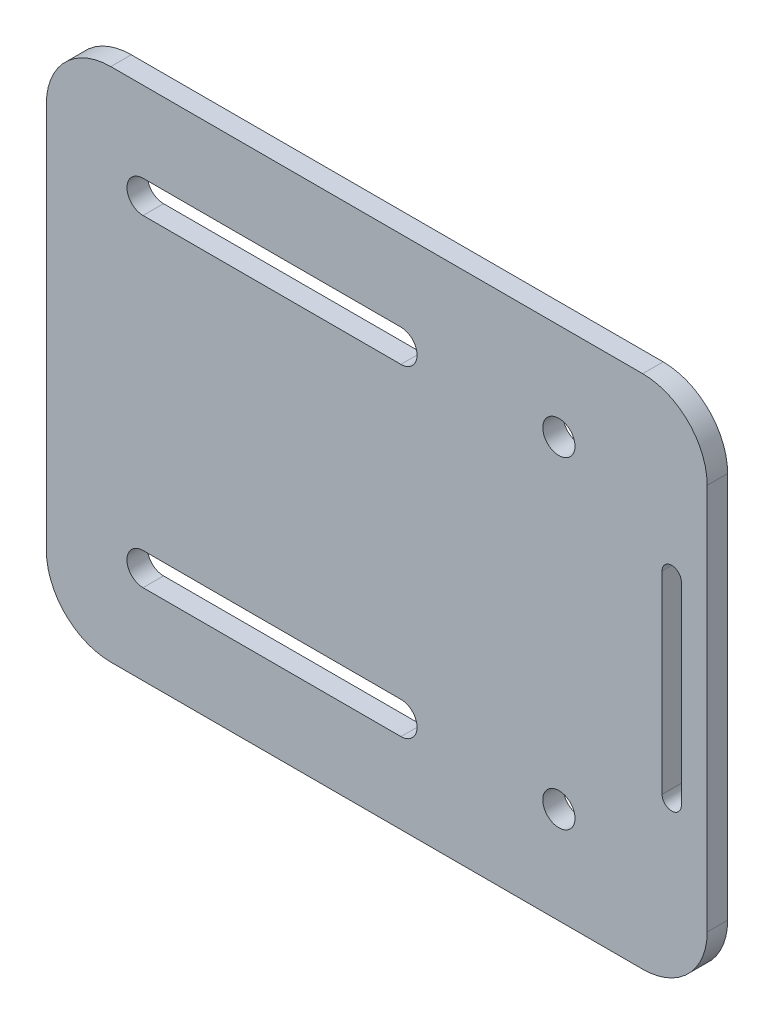
ISO-10303-21;
HEADER;
FILE_DESCRIPTION(('STEP AP214'),'2;1');
FILE_NAME('part.step','',(''),(''),'','','');
FILE_SCHEMA(('AUTOMOTIVE_DESIGN { 1 0 10303 214 1 1 1 1 }'));
ENDSEC;
DATA;
#1=APPLICATION_CONTEXT('core data for automotive mechanical design processes');
#2=APPLICATION_PROTOCOL_DEFINITION('international standard','automotive_design',2000,#1);
#3=PRODUCT_CONTEXT('',#1,'mechanical');
#4=PRODUCT('Part','Part','',(#3));
#5=PRODUCT_RELATED_PRODUCT_CATEGORY('part','',(#4));
#6=PRODUCT_DEFINITION_FORMATION('','',#4);
#7=PRODUCT_DEFINITION_CONTEXT('part definition',#1,'design');
#8=PRODUCT_DEFINITION('design','',#6,#7);
#9=PRODUCT_DEFINITION_SHAPE('','',#8);
#10=(LENGTH_UNIT() NAMED_UNIT(*) SI_UNIT(.MILLI.,.METRE.));
#11=(NAMED_UNIT(*) PLANE_ANGLE_UNIT() SI_UNIT($,.RADIAN.));
#12=(NAMED_UNIT(*) SI_UNIT($,.STERADIAN.) SOLID_ANGLE_UNIT());
#13=UNCERTAINTY_MEASURE_WITH_UNIT(LENGTH_MEASURE(1.E-05),#10,'distance_accuracy_value','');
#14=(GEOMETRIC_REPRESENTATION_CONTEXT(3) GLOBAL_UNCERTAINTY_ASSIGNED_CONTEXT((#13)) GLOBAL_UNIT_ASSIGNED_CONTEXT((#10,
#11,#12)) REPRESENTATION_CONTEXT('',''));
#15=CARTESIAN_POINT('',(0.,0.,0.));
#16=DIRECTION('',(0.,0.,1.));
#17=DIRECTION('',(1.,0.,0.));
#18=AXIS2_PLACEMENT_3D('',#15,#16,#17);
#19=CARTESIAN_POINT('',(0.,0.,3.175));
#20=DIRECTION('',(0.,0.,-1.));
#21=DIRECTION('',(-1.,0.,0.));
#22=AXIS2_PLACEMENT_3D('',#19,#20,#21);
#23=PLANE('',#22);
#24=CARTESIAN_POINT('',(-64.5,-25.,3.175));
#25=DIRECTION('',(0.,0.,1.));
#26=DIRECTION('',(-1.,0.,0.));
#27=AXIS2_PLACEMENT_3D('',#24,#25,#26);
#28=CIRCLE('',#27,2.5);
#29=CARTESIAN_POINT('',(-64.5,-22.5,3.175));
#30=VERTEX_POINT('',#29);
#31=CARTESIAN_POINT('',(-64.5,-27.5,3.175));
#32=VERTEX_POINT('',#31);
#33=EDGE_CURVE('E212',#30,#32,#28,.T.);
#34=ORIENTED_EDGE('',*,*,#33,.F.);
#35=DIRECTION('',(-1.,0.,0.));
#36=VECTOR('',#35,1.);
#37=CARTESIAN_POINT('',(-64.5,-22.5,3.175));
#38=LINE('',#37,#36);
#39=CARTESIAN_POINT('',(-24.5,-22.5,3.175));
#40=VERTEX_POINT('',#39);
#41=EDGE_CURVE('E220',#40,#30,#38,.T.);
#42=ORIENTED_EDGE('',*,*,#41,.F.);
#43=CARTESIAN_POINT('',(-24.5,-25.,3.175));
#44=DIRECTION('',(0.,0.,1.));
#45=DIRECTION('',(-1.,0.,0.));
#46=AXIS2_PLACEMENT_3D('',#43,#44,#45);
#47=CIRCLE('',#46,2.5);
#48=CARTESIAN_POINT('',(-24.5,-27.5,3.175));
#49=VERTEX_POINT('',#48);
#50=EDGE_CURVE('E217',#49,#40,#47,.T.);
#51=ORIENTED_EDGE('',*,*,#50,.F.);
#52=DIRECTION('',(1.,0.,0.));
#53=VECTOR('',#52,1.);
#54=CARTESIAN_POINT('',(-64.5,-27.5,3.175));
#55=LINE('',#54,#53);
#56=EDGE_CURVE('E214',#32,#49,#55,.T.);
#57=ORIENTED_EDGE('',*,*,#56,.F.);
#58=EDGE_LOOP('',(#34,#42,#51,#57));
#59=FACE_BOUND('',#58,.T.);
#60=DIRECTION('',(0.,1.,0.));
#61=VECTOR('',#60,1.);
#62=CARTESIAN_POINT('',(23.,-40.,3.175));
#63=LINE('',#62,#61);
#64=CARTESIAN_POINT('',(23.,-30.,3.175));
#65=VERTEX_POINT('',#64);
#66=CARTESIAN_POINT('',(23.,30.,3.175));
#67=VERTEX_POINT('',#66);
#68=EDGE_CURVE('E286',#65,#67,#63,.T.);
#69=ORIENTED_EDGE('',*,*,#68,.T.);
#70=CARTESIAN_POINT('',(13.,30.,3.175));
#71=DIRECTION('',(0.,0.,-1.));
#72=DIRECTION('',(-1.,0.,0.));
#73=AXIS2_PLACEMENT_3D('',#70,#71,#72);
#74=CIRCLE('',#73,10.);
#75=CARTESIAN_POINT('',(13.,40.,3.175));
#76=VERTEX_POINT('',#75);
#77=EDGE_CURVE('E329',#67,#76,#74,.F.);
#78=ORIENTED_EDGE('',*,*,#77,.T.);
#79=DIRECTION('',(-1.,0.,0.));
#80=VECTOR('',#79,1.);
#81=CARTESIAN_POINT('',(-79.5,40.,3.175));
#82=LINE('',#81,#80);
#83=CARTESIAN_POINT('',(-69.5,40.,3.175));
#84=VERTEX_POINT('',#83);
#85=EDGE_CURVE('E289',#76,#84,#82,.T.);
#86=ORIENTED_EDGE('',*,*,#85,.T.);
#87=CARTESIAN_POINT('',(-69.5,30.,3.175));
#88=DIRECTION('',(0.,0.,-1.));
#89=DIRECTION('',(-1.,0.,0.));
#90=AXIS2_PLACEMENT_3D('',#87,#88,#89);
#91=CIRCLE('',#90,10.);
#92=CARTESIAN_POINT('',(-79.5,30.,3.175));
#93=VERTEX_POINT('',#92);
#94=EDGE_CURVE('E324',#84,#93,#91,.F.);
#95=ORIENTED_EDGE('',*,*,#94,.T.);
#96=DIRECTION('',(0.,-1.,0.));
#97=VECTOR('',#96,1.);
#98=CARTESIAN_POINT('',(-79.5,-40.,3.175));
#99=LINE('',#98,#97);
#100=CARTESIAN_POINT('',(-79.5,-30.,3.175));
#101=VERTEX_POINT('',#100);
#102=EDGE_CURVE('E293',#93,#101,#99,.T.);
#103=ORIENTED_EDGE('',*,*,#102,.T.);
#104=CARTESIAN_POINT('',(-69.5,-30.,3.175));
#105=DIRECTION('',(0.,0.,-1.));
#106=DIRECTION('',(-1.,0.,0.));
#107=AXIS2_PLACEMENT_3D('',#104,#105,#106);
#108=CIRCLE('',#107,10.);
#109=CARTESIAN_POINT('',(-69.5,-40.,3.175));
#110=VERTEX_POINT('',#109);
#111=EDGE_CURVE('E54',#101,#110,#108,.F.);
#112=ORIENTED_EDGE('',*,*,#111,.T.);
#113=DIRECTION('',(1.,0.,0.));
#114=VECTOR('',#113,1.);
#115=CARTESIAN_POINT('',(-79.5,-40.,3.175));
#116=LINE('',#115,#114);
#117=CARTESIAN_POINT('',(13.,-40.,3.175));
#118=VERTEX_POINT('',#117);
#119=EDGE_CURVE('E295',#110,#118,#116,.T.);
#120=ORIENTED_EDGE('',*,*,#119,.T.);
#121=CARTESIAN_POINT('',(13.,-30.,3.175));
#122=DIRECTION('',(0.,0.,-1.));
#123=DIRECTION('',(-1.,0.,0.));
#124=AXIS2_PLACEMENT_3D('',#121,#122,#123);
#125=CIRCLE('',#124,10.);
#126=EDGE_CURVE('E327',#118,#65,#125,.F.);
#127=ORIENTED_EDGE('',*,*,#126,.T.);
#128=EDGE_LOOP('',(#69,#78,#86,#95,#103,#112,#120,#127));
#129=FACE_BOUND('',#128,.T.);
#130=CARTESIAN_POINT('',(-64.5,25.,3.175));
#131=DIRECTION('',(0.,0.,1.));
#132=DIRECTION('',(1.,0.,0.));
#133=AXIS2_PLACEMENT_3D('',#130,#131,#132);
#134=CIRCLE('',#133,2.5);
#135=CARTESIAN_POINT('',(-64.5,27.5,3.175));
#136=VERTEX_POINT('',#135);
#137=CARTESIAN_POINT('',(-64.5,22.5,3.175));
#138=VERTEX_POINT('',#137);
#139=EDGE_CURVE('E255',#136,#138,#134,.T.);
#140=ORIENTED_EDGE('',*,*,#139,.F.);
#141=DIRECTION('',(-1.,0.,0.));
#142=VECTOR('',#141,1.);
#143=CARTESIAN_POINT('',(-64.5,27.5,3.175));
#144=LINE('',#143,#142);
#145=CARTESIAN_POINT('',(-24.5,27.5,3.175));
#146=VERTEX_POINT('',#145);
#147=EDGE_CURVE('E263',#146,#136,#144,.T.);
#148=ORIENTED_EDGE('',*,*,#147,.F.);
#149=CARTESIAN_POINT('',(-24.5,25.,3.175));
#150=DIRECTION('',(0.,0.,1.));
#151=DIRECTION('',(1.,0.,0.));
#152=AXIS2_PLACEMENT_3D('',#149,#150,#151);
#153=CIRCLE('',#152,2.5);
#154=CARTESIAN_POINT('',(-24.5,22.5,3.175));
#155=VERTEX_POINT('',#154);
#156=EDGE_CURVE('E260',#155,#146,#153,.T.);
#157=ORIENTED_EDGE('',*,*,#156,.F.);
#158=DIRECTION('',(1.,0.,0.));
#159=VECTOR('',#158,1.);
#160=CARTESIAN_POINT('',(-64.5,22.5,3.175));
#161=LINE('',#160,#159);
#162=EDGE_CURVE('E257',#138,#155,#161,.T.);
#163=ORIENTED_EDGE('',*,*,#162,.F.);
#164=EDGE_LOOP('',(#140,#148,#157,#163));
#165=FACE_BOUND('',#164,.T.);
#166=CARTESIAN_POINT('',(0.,25.,3.175));
#167=DIRECTION('',(0.,0.,1.));
#168=DIRECTION('',(1.,0.,0.));
#169=AXIS2_PLACEMENT_3D('',#166,#167,#168);
#170=CIRCLE('',#169,2.5);
#171=CARTESIAN_POINT('',(2.50000000000001,25.,3.175));
#172=VERTEX_POINT('',#171);
#173=EDGE_CURVE('E249',#172,#172,#170,.T.);
#174=ORIENTED_EDGE('',*,*,#173,.F.);
#175=EDGE_LOOP('',(#174));
#176=FACE_BOUND('',#175,.T.);
#177=CARTESIAN_POINT('',(0.,-25.,3.175));
#178=DIRECTION('',(0.,0.,1.));
#179=DIRECTION('',(-1.,0.,0.));
#180=AXIS2_PLACEMENT_3D('',#177,#178,#179);
#181=CIRCLE('',#180,2.5);
#182=CARTESIAN_POINT('',(-2.49999999999999,-25.,3.175));
#183=VERTEX_POINT('',#182);
#184=EDGE_CURVE('E243',#183,#183,#181,.T.);
#185=ORIENTED_EDGE('',*,*,#184,.F.);
#186=EDGE_LOOP('',(#185));
#187=FACE_BOUND('',#186,.T.);
#188=CARTESIAN_POINT('',(17.5,15.,3.175));
#189=DIRECTION('',(0.,0.,1.));
#190=DIRECTION('',(1.,0.,0.));
#191=AXIS2_PLACEMENT_3D('',#188,#189,#190);
#192=CIRCLE('',#191,1.49999999999999);
#193=CARTESIAN_POINT('',(19.,15.,3.175));
#194=VERTEX_POINT('',#193);
#195=CARTESIAN_POINT('',(16.,15.,3.175));
#196=VERTEX_POINT('',#195);
#197=EDGE_CURVE('E171',#194,#196,#192,.T.);
#198=ORIENTED_EDGE('',*,*,#197,.F.);
#199=DIRECTION('',(0.,1.,0.));
#200=VECTOR('',#199,1.);
#201=CARTESIAN_POINT('',(19.,15.,3.175));
#202=LINE('',#201,#200);
#203=CARTESIAN_POINT('',(19.,-15.,3.175));
#204=VERTEX_POINT('',#203);
#205=EDGE_CURVE('E196',#204,#194,#202,.T.);
#206=ORIENTED_EDGE('',*,*,#205,.F.);
#207=CARTESIAN_POINT('',(17.5,-15.,3.175));
#208=DIRECTION('',(0.,0.,1.));
#209=DIRECTION('',(1.,0.,0.));
#210=AXIS2_PLACEMENT_3D('',#207,#208,#209);
#211=CIRCLE('',#210,1.49999999999999);
#212=CARTESIAN_POINT('',(16.,-15.,3.175));
#213=VERTEX_POINT('',#212);
#214=EDGE_CURVE('E194',#213,#204,#211,.T.);
#215=ORIENTED_EDGE('',*,*,#214,.F.);
#216=DIRECTION('',(0.,-1.,0.));
#217=VECTOR('',#216,1.);
#218=CARTESIAN_POINT('',(16.,15.,3.175));
#219=LINE('',#218,#217);
#220=EDGE_CURVE('E181',#196,#213,#219,.T.);
#221=ORIENTED_EDGE('',*,*,#220,.F.);
#222=EDGE_LOOP('',(#198,#206,#215,#221));
#223=FACE_BOUND('',#222,.T.);
#224=ADVANCED_FACE('F32',(#59,#129,#165,#176,#187,#223),#23,.F.);
#225=CARTESIAN_POINT('',(0.,0.,0.));
#226=DIRECTION('',(0.,0.,-1.));
#227=DIRECTION('',(-1.,0.,0.));
#228=AXIS2_PLACEMENT_3D('',#225,#226,#227);
#229=PLANE('',#228);
#230=CARTESIAN_POINT('',(0.,25.,0.));
#231=DIRECTION('',(0.,0.,1.));
#232=DIRECTION('',(1.,0.,0.));
#233=AXIS2_PLACEMENT_3D('',#230,#231,#232);
#234=CIRCLE('',#233,2.5);
#235=CARTESIAN_POINT('',(2.50000000000001,25.,0.));
#236=VERTEX_POINT('',#235);
#237=EDGE_CURVE('E246',#236,#236,#234,.T.);
#238=ORIENTED_EDGE('',*,*,#237,.T.);
#239=EDGE_LOOP('',(#238));
#240=FACE_BOUND('',#239,.T.);
#241=DIRECTION('',(-1.,0.,0.));
#242=VECTOR('',#241,1.);
#243=CARTESIAN_POINT('',(-79.5,40.,0.));
#244=LINE('',#243,#242);
#245=CARTESIAN_POINT('',(13.,40.,0.));
#246=VERTEX_POINT('',#245);
#247=CARTESIAN_POINT('',(-69.5,40.,0.));
#248=VERTEX_POINT('',#247);
#249=EDGE_CURVE('E300',#246,#248,#244,.T.);
#250=ORIENTED_EDGE('',*,*,#249,.F.);
#251=CARTESIAN_POINT('',(13.,30.,0.));
#252=DIRECTION('',(0.,0.,-1.));
#253=DIRECTION('',(-1.,0.,0.));
#254=AXIS2_PLACEMENT_3D('',#251,#252,#253);
#255=CIRCLE('',#254,10.);
#256=CARTESIAN_POINT('',(23.,30.,0.));
#257=VERTEX_POINT('',#256);
#258=EDGE_CURVE('E317',#246,#257,#255,.T.);
#259=ORIENTED_EDGE('',*,*,#258,.T.);
#260=DIRECTION('',(0.,1.,0.));
#261=VECTOR('',#260,1.);
#262=CARTESIAN_POINT('',(23.,-40.,0.));
#263=LINE('',#262,#261);
#264=CARTESIAN_POINT('',(23.,-30.,0.));
#265=VERTEX_POINT('',#264);
#266=EDGE_CURVE('E285',#265,#257,#263,.T.);
#267=ORIENTED_EDGE('',*,*,#266,.F.);
#268=CARTESIAN_POINT('',(13.,-30.,0.));
#269=DIRECTION('',(0.,0.,-1.));
#270=DIRECTION('',(-1.,0.,0.));
#271=AXIS2_PLACEMENT_3D('',#268,#269,#270);
#272=CIRCLE('',#271,10.);
#273=CARTESIAN_POINT('',(13.,-40.,0.));
#274=VERTEX_POINT('',#273);
#275=EDGE_CURVE('E315',#265,#274,#272,.T.);
#276=ORIENTED_EDGE('',*,*,#275,.T.);
#277=DIRECTION('',(1.,0.,0.));
#278=VECTOR('',#277,1.);
#279=CARTESIAN_POINT('',(-79.5,-40.,0.));
#280=LINE('',#279,#278);
#281=CARTESIAN_POINT('',(-69.5,-40.,0.));
#282=VERTEX_POINT('',#281);
#283=EDGE_CURVE('E290',#282,#274,#280,.T.);
#284=ORIENTED_EDGE('',*,*,#283,.F.);
#285=CARTESIAN_POINT('',(-69.5,-30.,0.));
#286=DIRECTION('',(0.,0.,-1.));
#287=DIRECTION('',(-1.,0.,0.));
#288=AXIS2_PLACEMENT_3D('',#285,#286,#287);
#289=CIRCLE('',#288,10.);
#290=CARTESIAN_POINT('',(-79.5,-30.,0.));
#291=VERTEX_POINT('',#290);
#292=EDGE_CURVE('E313',#282,#291,#289,.T.);
#293=ORIENTED_EDGE('',*,*,#292,.T.);
#294=DIRECTION('',(0.,-1.,0.));
#295=VECTOR('',#294,1.);
#296=CARTESIAN_POINT('',(-79.5,-40.,0.));
#297=LINE('',#296,#295);
#298=CARTESIAN_POINT('',(-79.5,30.,0.));
#299=VERTEX_POINT('',#298);
#300=EDGE_CURVE('E303',#299,#291,#297,.T.);
#301=ORIENTED_EDGE('',*,*,#300,.F.);
#302=CARTESIAN_POINT('',(-69.5,30.,0.));
#303=DIRECTION('',(0.,0.,-1.));
#304=DIRECTION('',(-1.,0.,0.));
#305=AXIS2_PLACEMENT_3D('',#302,#303,#304);
#306=CIRCLE('',#305,10.);
#307=EDGE_CURVE('E311',#299,#248,#306,.T.);
#308=ORIENTED_EDGE('',*,*,#307,.T.);
#309=EDGE_LOOP('',(#250,#259,#267,#276,#284,#293,#301,#308));
#310=FACE_BOUND('',#309,.T.);
#311=DIRECTION('',(-1.,0.,0.));
#312=VECTOR('',#311,1.);
#313=CARTESIAN_POINT('',(-64.5,27.5,0.));
#314=LINE('',#313,#312);
#315=CARTESIAN_POINT('',(-24.5,27.5,0.));
#316=VERTEX_POINT('',#315);
#317=CARTESIAN_POINT('',(-64.5,27.5,0.));
#318=VERTEX_POINT('',#317);
#319=EDGE_CURVE('E258',#316,#318,#314,.T.);
#320=ORIENTED_EDGE('',*,*,#319,.T.);
#321=CARTESIAN_POINT('',(-64.5,25.,0.));
#322=DIRECTION('',(0.,0.,1.));
#323=DIRECTION('',(1.,0.,0.));
#324=AXIS2_PLACEMENT_3D('',#321,#322,#323);
#325=CIRCLE('',#324,2.5);
#326=CARTESIAN_POINT('',(-64.5,22.5,0.));
#327=VERTEX_POINT('',#326);
#328=EDGE_CURVE('E252',#318,#327,#325,.T.);
#329=ORIENTED_EDGE('',*,*,#328,.T.);
#330=DIRECTION('',(1.,0.,0.));
#331=VECTOR('',#330,1.);
#332=CARTESIAN_POINT('',(-64.5,22.5,0.));
#333=LINE('',#332,#331);
#334=CARTESIAN_POINT('',(-24.5,22.5,0.));
#335=VERTEX_POINT('',#334);
#336=EDGE_CURVE('E268',#327,#335,#333,.T.);
#337=ORIENTED_EDGE('',*,*,#336,.T.);
#338=CARTESIAN_POINT('',(-24.5,25.,0.));
#339=DIRECTION('',(0.,0.,1.));
#340=DIRECTION('',(1.,0.,0.));
#341=AXIS2_PLACEMENT_3D('',#338,#339,#340);
#342=CIRCLE('',#341,2.5);
#343=EDGE_CURVE('E271',#335,#316,#342,.T.);
#344=ORIENTED_EDGE('',*,*,#343,.T.);
#345=EDGE_LOOP('',(#320,#329,#337,#344));
#346=FACE_BOUND('',#345,.T.);
#347=CARTESIAN_POINT('',(0.,-25.,0.));
#348=DIRECTION('',(0.,0.,1.));
#349=DIRECTION('',(-1.,0.,0.));
#350=AXIS2_PLACEMENT_3D('',#347,#348,#349);
#351=CIRCLE('',#350,2.5);
#352=CARTESIAN_POINT('',(-2.49999999999999,-25.,0.));
#353=VERTEX_POINT('',#352);
#354=EDGE_CURVE('E242',#353,#353,#351,.T.);
#355=ORIENTED_EDGE('',*,*,#354,.T.);
#356=EDGE_LOOP('',(#355));
#357=FACE_BOUND('',#356,.T.);
#358=DIRECTION('',(-1.,0.,0.));
#359=VECTOR('',#358,1.);
#360=CARTESIAN_POINT('',(-64.5,-22.5,0.));
#361=LINE('',#360,#359);
#362=CARTESIAN_POINT('',(-24.5,-22.5,0.));
#363=VERTEX_POINT('',#362);
#364=CARTESIAN_POINT('',(-64.5,-22.5,0.));
#365=VERTEX_POINT('',#364);
#366=EDGE_CURVE('E215',#363,#365,#361,.T.);
#367=ORIENTED_EDGE('',*,*,#366,.T.);
#368=CARTESIAN_POINT('',(-64.5,-25.,0.));
#369=DIRECTION('',(0.,0.,1.));
#370=DIRECTION('',(-1.,0.,0.));
#371=AXIS2_PLACEMENT_3D('',#368,#369,#370);
#372=CIRCLE('',#371,2.5);
#373=CARTESIAN_POINT('',(-64.5,-27.5,0.));
#374=VERTEX_POINT('',#373);
#375=EDGE_CURVE('E189',#365,#374,#372,.T.);
#376=ORIENTED_EDGE('',*,*,#375,.T.);
#377=DIRECTION('',(1.,0.,0.));
#378=VECTOR('',#377,1.);
#379=CARTESIAN_POINT('',(-64.5,-27.5,0.));
#380=LINE('',#379,#378);
#381=CARTESIAN_POINT('',(-24.5,-27.5,0.));
#382=VERTEX_POINT('',#381);
#383=EDGE_CURVE('E225',#374,#382,#380,.T.);
#384=ORIENTED_EDGE('',*,*,#383,.T.);
#385=CARTESIAN_POINT('',(-24.5,-25.,0.));
#386=DIRECTION('',(0.,0.,1.));
#387=DIRECTION('',(-1.,0.,0.));
#388=AXIS2_PLACEMENT_3D('',#385,#386,#387);
#389=CIRCLE('',#388,2.5);
#390=EDGE_CURVE('E228',#382,#363,#389,.T.);
#391=ORIENTED_EDGE('',*,*,#390,.T.);
#392=EDGE_LOOP('',(#367,#376,#384,#391));
#393=FACE_BOUND('',#392,.T.);
#394=DIRECTION('',(0.,1.,0.));
#395=VECTOR('',#394,1.);
#396=CARTESIAN_POINT('',(19.,15.,0.));
#397=LINE('',#396,#395);
#398=CARTESIAN_POINT('',(19.,-15.,0.));
#399=VERTEX_POINT('',#398);
#400=CARTESIAN_POINT('',(19.,15.,0.));
#401=VERTEX_POINT('',#400);
#402=EDGE_CURVE('E182',#399,#401,#397,.T.);
#403=ORIENTED_EDGE('',*,*,#402,.T.);
#404=CARTESIAN_POINT('',(17.5,15.,0.));
#405=DIRECTION('',(0.,0.,1.));
#406=DIRECTION('',(1.,0.,0.));
#407=AXIS2_PLACEMENT_3D('',#404,#405,#406);
#408=CIRCLE('',#407,1.49999999999999);
#409=CARTESIAN_POINT('',(16.,15.,0.));
#410=VERTEX_POINT('',#409);
#411=EDGE_CURVE('E200',#401,#410,#408,.T.);
#412=ORIENTED_EDGE('',*,*,#411,.T.);
#413=DIRECTION('',(0.,-1.,0.));
#414=VECTOR('',#413,1.);
#415=CARTESIAN_POINT('',(16.,15.,0.));
#416=LINE('',#415,#414);
#417=CARTESIAN_POINT('',(16.,-15.,0.));
#418=VERTEX_POINT('',#417);
#419=EDGE_CURVE('E188',#410,#418,#416,.T.);
#420=ORIENTED_EDGE('',*,*,#419,.T.);
#421=CARTESIAN_POINT('',(17.5,-15.,0.));
#422=DIRECTION('',(0.,0.,1.));
#423=DIRECTION('',(1.,0.,0.));
#424=AXIS2_PLACEMENT_3D('',#421,#422,#423);
#425=CIRCLE('',#424,1.49999999999999);
#426=EDGE_CURVE('E203',#418,#399,#425,.T.);
#427=ORIENTED_EDGE('',*,*,#426,.T.);
#428=EDGE_LOOP('',(#403,#412,#420,#427));
#429=FACE_BOUND('',#428,.T.);
#430=ADVANCED_FACE('F345',(#240,#310,#346,#357,#393,#429),#229,.T.);
#431=CARTESIAN_POINT('',(23.,-40.,3.175));
#432=DIRECTION('',(-1.,0.,0.));
#433=DIRECTION('',(0.,0.,1.));
#434=AXIS2_PLACEMENT_3D('',#431,#432,#433);
#435=PLANE('',#434);
#436=ORIENTED_EDGE('',*,*,#266,.T.);
#437=DIRECTION('',(0.,0.,-1.));
#438=VECTOR('',#437,1.);
#439=CARTESIAN_POINT('',(23.,30.,3.175));
#440=LINE('',#439,#438);
#441=EDGE_CURVE('E322',#257,#67,#440,.F.);
#442=ORIENTED_EDGE('',*,*,#441,.T.);
#443=ORIENTED_EDGE('',*,*,#68,.F.);
#444=DIRECTION('',(0.,0.,-1.));
#445=VECTOR('',#444,1.);
#446=CARTESIAN_POINT('',(23.,-30.,3.175));
#447=LINE('',#446,#445);
#448=EDGE_CURVE('E319',#65,#265,#447,.T.);
#449=ORIENTED_EDGE('',*,*,#448,.T.);
#450=EDGE_LOOP('',(#436,#442,#443,#449));
#451=FACE_BOUND('',#450,.T.);
#452=ADVANCED_FACE('F360',(#451),#435,.F.);
#453=CARTESIAN_POINT('',(-79.5,40.,3.175));
#454=DIRECTION('',(0.,-1.,0.));
#455=DIRECTION('',(0.,0.,-1.));
#456=AXIS2_PLACEMENT_3D('',#453,#454,#455);
#457=PLANE('',#456);
#458=ORIENTED_EDGE('',*,*,#85,.F.);
#459=DIRECTION('',(0.,0.,-1.));
#460=VECTOR('',#459,1.);
#461=CARTESIAN_POINT('',(13.,40.,3.175));
#462=LINE('',#461,#460);
#463=EDGE_CURVE('E308',#76,#246,#462,.T.);
#464=ORIENTED_EDGE('',*,*,#463,.T.);
#465=ORIENTED_EDGE('',*,*,#249,.T.);
#466=DIRECTION('',(0.,0.,-1.));
#467=VECTOR('',#466,1.);
#468=CARTESIAN_POINT('',(-69.5,40.,3.175));
#469=LINE('',#468,#467);
#470=EDGE_CURVE('E297',#248,#84,#469,.F.);
#471=ORIENTED_EDGE('',*,*,#470,.T.);
#472=EDGE_LOOP('',(#458,#464,#465,#471));
#473=FACE_BOUND('',#472,.T.);
#474=ADVANCED_FACE('F368',(#473),#457,.F.);
#475=CARTESIAN_POINT('',(-79.5,-40.,3.175));
#476=DIRECTION('',(1.,0.,0.));
#477=DIRECTION('',(0.,0.,-1.));
#478=AXIS2_PLACEMENT_3D('',#475,#476,#477);
#479=PLANE('',#478);
#480=ORIENTED_EDGE('',*,*,#300,.T.);
#481=DIRECTION('',(0.,0.,-1.));
#482=VECTOR('',#481,1.);
#483=CARTESIAN_POINT('',(-79.5,-30.,3.175));
#484=LINE('',#483,#482);
#485=EDGE_CURVE('E11',#291,#101,#484,.F.);
#486=ORIENTED_EDGE('',*,*,#485,.T.);
#487=ORIENTED_EDGE('',*,*,#102,.F.);
#488=DIRECTION('',(0.,0.,-1.));
#489=VECTOR('',#488,1.);
#490=CARTESIAN_POINT('',(-79.5,30.,3.175));
#491=LINE('',#490,#489);
#492=EDGE_CURVE('E40',#93,#299,#491,.T.);
#493=ORIENTED_EDGE('',*,*,#492,.T.);
#494=EDGE_LOOP('',(#480,#486,#487,#493));
#495=FACE_BOUND('',#494,.T.);
#496=ADVANCED_FACE('F339',(#495),#479,.F.);
#497=CARTESIAN_POINT('',(-79.5,-40.,3.175));
#498=DIRECTION('',(0.,1.,0.));
#499=DIRECTION('',(0.,0.,1.));
#500=AXIS2_PLACEMENT_3D('',#497,#498,#499);
#501=PLANE('',#500);
#502=ORIENTED_EDGE('',*,*,#283,.T.);
#503=DIRECTION('',(0.,0.,-1.));
#504=VECTOR('',#503,1.);
#505=CARTESIAN_POINT('',(13.,-40.,3.175));
#506=LINE('',#505,#504);
#507=EDGE_CURVE('E47',#274,#118,#506,.F.);
#508=ORIENTED_EDGE('',*,*,#507,.T.);
#509=ORIENTED_EDGE('',*,*,#119,.F.);
#510=DIRECTION('',(0.,0.,-1.));
#511=VECTOR('',#510,1.);
#512=CARTESIAN_POINT('',(-69.5,-40.,3.175));
#513=LINE('',#512,#511);
#514=EDGE_CURVE('E331',#110,#282,#513,.T.);
#515=ORIENTED_EDGE('',*,*,#514,.T.);
#516=EDGE_LOOP('',(#502,#508,#509,#515));
#517=FACE_BOUND('',#516,.T.);
#518=ADVANCED_FACE('F351',(#517),#501,.F.);
#519=CARTESIAN_POINT('',(-64.5,25.,3.175));
#520=DIRECTION('',(0.,0.,-1.));
#521=DIRECTION('',(-1.,0.,0.));
#522=AXIS2_PLACEMENT_3D('',#519,#520,#521);
#523=CYLINDRICAL_SURFACE('',#522,2.5);
#524=ORIENTED_EDGE('',*,*,#328,.F.);
#525=DIRECTION('',(0.,0.,-1.));
#526=VECTOR('',#525,1.);
#527=CARTESIAN_POINT('',(-64.5,27.5,3.175));
#528=LINE('',#527,#526);
#529=EDGE_CURVE('E265',#136,#318,#528,.T.);
#530=ORIENTED_EDGE('',*,*,#529,.F.);
#531=ORIENTED_EDGE('',*,*,#139,.T.);
#532=DIRECTION('',(0.,0.,-1.));
#533=VECTOR('',#532,1.);
#534=CARTESIAN_POINT('',(-64.5,22.5,3.175));
#535=LINE('',#534,#533);
#536=EDGE_CURVE('E282',#138,#327,#535,.T.);
#537=ORIENTED_EDGE('',*,*,#536,.T.);
#538=EDGE_LOOP('',(#524,#530,#531,#537));
#539=FACE_BOUND('',#538,.T.);
#540=ADVANCED_FACE('F384',(#539),#523,.F.);
#541=CARTESIAN_POINT('',(-64.5,22.5,3.175));
#542=DIRECTION('',(0.,1.,0.));
#543=DIRECTION('',(0.,0.,1.));
#544=AXIS2_PLACEMENT_3D('',#541,#542,#543);
#545=PLANE('',#544);
#546=ORIENTED_EDGE('',*,*,#336,.F.);
#547=ORIENTED_EDGE('',*,*,#536,.F.);
#548=ORIENTED_EDGE('',*,*,#162,.T.);
#549=DIRECTION('',(0.,0.,-1.));
#550=VECTOR('',#549,1.);
#551=CARTESIAN_POINT('',(-24.5,22.5,3.175));
#552=LINE('',#551,#550);
#553=EDGE_CURVE('E280',#155,#335,#552,.T.);
#554=ORIENTED_EDGE('',*,*,#553,.T.);
#555=EDGE_LOOP('',(#546,#547,#548,#554));
#556=FACE_BOUND('',#555,.T.);
#557=ADVANCED_FACE('F523',(#556),#545,.T.);
#558=CARTESIAN_POINT('',(-24.5,25.,3.175));
#559=DIRECTION('',(0.,0.,-1.));
#560=DIRECTION('',(-1.,0.,0.));
#561=AXIS2_PLACEMENT_3D('',#558,#559,#560);
#562=CYLINDRICAL_SURFACE('',#561,2.5);
#563=ORIENTED_EDGE('',*,*,#343,.F.);
#564=ORIENTED_EDGE('',*,*,#553,.F.);
#565=ORIENTED_EDGE('',*,*,#156,.T.);
#566=DIRECTION('',(0.,0.,-1.));
#567=VECTOR('',#566,1.);
#568=CARTESIAN_POINT('',(-24.5,27.5,3.175));
#569=LINE('',#568,#567);
#570=EDGE_CURVE('E278',#146,#316,#569,.T.);
#571=ORIENTED_EDGE('',*,*,#570,.T.);
#572=EDGE_LOOP('',(#563,#564,#565,#571));
#573=FACE_BOUND('',#572,.T.);
#574=ADVANCED_FACE('F514',(#573),#562,.F.);
#575=CARTESIAN_POINT('',(-64.5,27.5,3.175));
#576=DIRECTION('',(0.,-1.,0.));
#577=DIRECTION('',(0.,0.,-1.));
#578=AXIS2_PLACEMENT_3D('',#575,#576,#577);
#579=PLANE('',#578);
#580=ORIENTED_EDGE('',*,*,#319,.F.);
#581=ORIENTED_EDGE('',*,*,#570,.F.);
#582=ORIENTED_EDGE('',*,*,#147,.T.);
#583=ORIENTED_EDGE('',*,*,#529,.T.);
#584=EDGE_LOOP('',(#580,#581,#582,#583));
#585=FACE_BOUND('',#584,.T.);
#586=ADVANCED_FACE('F505',(#585),#579,.T.);
#587=CARTESIAN_POINT('',(0.,25.,3.175));
#588=DIRECTION('',(0.,0.,-1.));
#589=DIRECTION('',(-1.,0.,0.));
#590=AXIS2_PLACEMENT_3D('',#587,#588,#589);
#591=CYLINDRICAL_SURFACE('',#590,2.5);
#592=ORIENTED_EDGE('',*,*,#173,.T.);
#593=EDGE_LOOP('',(#592));
#594=FACE_BOUND('',#593,.T.);
#595=ORIENTED_EDGE('',*,*,#237,.F.);
#596=EDGE_LOOP('',(#595));
#597=FACE_BOUND('',#596,.T.);
#598=ADVANCED_FACE('F496',(#594,#597),#591,.F.);
#599=CARTESIAN_POINT('',(0.,-25.,3.175));
#600=DIRECTION('',(0.,0.,-1.));
#601=DIRECTION('',(-1.,0.,0.));
#602=AXIS2_PLACEMENT_3D('',#599,#600,#601);
#603=CYLINDRICAL_SURFACE('',#602,2.5);
#604=ORIENTED_EDGE('',*,*,#184,.T.);
#605=EDGE_LOOP('',(#604));
#606=FACE_BOUND('',#605,.T.);
#607=ORIENTED_EDGE('',*,*,#354,.F.);
#608=EDGE_LOOP('',(#607));
#609=FACE_BOUND('',#608,.T.);
#610=ADVANCED_FACE('F487',(#606,#609),#603,.F.);
#611=CARTESIAN_POINT('',(-64.5,-25.,3.175));
#612=DIRECTION('',(0.,0.,-1.));
#613=DIRECTION('',(-1.,0.,0.));
#614=AXIS2_PLACEMENT_3D('',#611,#612,#613);
#615=CYLINDRICAL_SURFACE('',#614,2.5);
#616=ORIENTED_EDGE('',*,*,#375,.F.);
#617=DIRECTION('',(0.,0.,-1.));
#618=VECTOR('',#617,1.);
#619=CARTESIAN_POINT('',(-64.5,-22.5,3.175));
#620=LINE('',#619,#618);
#621=EDGE_CURVE('E222',#30,#365,#620,.T.);
#622=ORIENTED_EDGE('',*,*,#621,.F.);
#623=ORIENTED_EDGE('',*,*,#33,.T.);
#624=DIRECTION('',(0.,0.,-1.));
#625=VECTOR('',#624,1.);
#626=CARTESIAN_POINT('',(-64.5,-27.5,3.175));
#627=LINE('',#626,#625);
#628=EDGE_CURVE('E239',#32,#374,#627,.T.);
#629=ORIENTED_EDGE('',*,*,#628,.T.);
#630=EDGE_LOOP('',(#616,#622,#623,#629));
#631=FACE_BOUND('',#630,.T.);
#632=ADVANCED_FACE('F478',(#631),#615,.F.);
#633=CARTESIAN_POINT('',(-64.5,-27.5,3.175));
#634=DIRECTION('',(0.,1.,0.));
#635=DIRECTION('',(0.,0.,1.));
#636=AXIS2_PLACEMENT_3D('',#633,#634,#635);
#637=PLANE('',#636);
#638=ORIENTED_EDGE('',*,*,#383,.F.);
#639=ORIENTED_EDGE('',*,*,#628,.F.);
#640=ORIENTED_EDGE('',*,*,#56,.T.);
#641=DIRECTION('',(0.,0.,-1.));
#642=VECTOR('',#641,1.);
#643=CARTESIAN_POINT('',(-24.5,-27.5,3.175));
#644=LINE('',#643,#642);
#645=EDGE_CURVE('E237',#49,#382,#644,.T.);
#646=ORIENTED_EDGE('',*,*,#645,.T.);
#647=EDGE_LOOP('',(#638,#639,#640,#646));
#648=FACE_BOUND('',#647,.T.);
#649=ADVANCED_FACE('F469',(#648),#637,.T.);
#650=CARTESIAN_POINT('',(-24.5,-25.,3.175));
#651=DIRECTION('',(0.,0.,-1.));
#652=DIRECTION('',(-1.,0.,0.));
#653=AXIS2_PLACEMENT_3D('',#650,#651,#652);
#654=CYLINDRICAL_SURFACE('',#653,2.5);
#655=ORIENTED_EDGE('',*,*,#390,.F.);
#656=ORIENTED_EDGE('',*,*,#645,.F.);
#657=ORIENTED_EDGE('',*,*,#50,.T.);
#658=DIRECTION('',(0.,0.,-1.));
#659=VECTOR('',#658,1.);
#660=CARTESIAN_POINT('',(-24.5,-22.5,3.175));
#661=LINE('',#660,#659);
#662=EDGE_CURVE('E235',#40,#363,#661,.T.);
#663=ORIENTED_EDGE('',*,*,#662,.T.);
#664=EDGE_LOOP('',(#655,#656,#657,#663));
#665=FACE_BOUND('',#664,.T.);
#666=ADVANCED_FACE('F460',(#665),#654,.F.);
#667=CARTESIAN_POINT('',(-64.5,-22.5,3.175));
#668=DIRECTION('',(0.,-1.,0.));
#669=DIRECTION('',(0.,0.,-1.));
#670=AXIS2_PLACEMENT_3D('',#667,#668,#669);
#671=PLANE('',#670);
#672=ORIENTED_EDGE('',*,*,#366,.F.);
#673=ORIENTED_EDGE('',*,*,#662,.F.);
#674=ORIENTED_EDGE('',*,*,#41,.T.);
#675=ORIENTED_EDGE('',*,*,#621,.T.);
#676=EDGE_LOOP('',(#672,#673,#674,#675));
#677=FACE_BOUND('',#676,.T.);
#678=ADVANCED_FACE('F452',(#677),#671,.T.);
#679=CARTESIAN_POINT('',(17.5,15.,3.175));
#680=DIRECTION('',(0.,0.,-1.));
#681=DIRECTION('',(-1.,0.,0.));
#682=AXIS2_PLACEMENT_3D('',#679,#680,#681);
#683=CYLINDRICAL_SURFACE('',#682,1.49999999999999);
#684=ORIENTED_EDGE('',*,*,#411,.F.);
#685=DIRECTION('',(0.,0.,-1.));
#686=VECTOR('',#685,1.);
#687=CARTESIAN_POINT('',(19.,15.,3.175));
#688=LINE('',#687,#686);
#689=EDGE_CURVE('E177',#194,#401,#688,.T.);
#690=ORIENTED_EDGE('',*,*,#689,.F.);
#691=ORIENTED_EDGE('',*,*,#197,.T.);
#692=DIRECTION('',(0.,0.,-1.));
#693=VECTOR('',#692,1.);
#694=CARTESIAN_POINT('',(16.,15.,3.175));
#695=LINE('',#694,#693);
#696=EDGE_CURVE('E174',#196,#410,#695,.T.);
#697=ORIENTED_EDGE('',*,*,#696,.T.);
#698=EDGE_LOOP('',(#684,#690,#691,#697));
#699=FACE_BOUND('',#698,.T.);
#700=ADVANCED_FACE('F173',(#699),#683,.F.);
#701=CARTESIAN_POINT('',(16.,15.,3.175));
#702=DIRECTION('',(1.,0.,0.));
#703=DIRECTION('',(0.,1.,0.));
#704=AXIS2_PLACEMENT_3D('',#701,#702,#703);
#705=PLANE('',#704);
#706=ORIENTED_EDGE('',*,*,#419,.F.);
#707=ORIENTED_EDGE('',*,*,#696,.F.);
#708=ORIENTED_EDGE('',*,*,#220,.T.);
#709=DIRECTION('',(0.,0.,-1.));
#710=VECTOR('',#709,1.);
#711=CARTESIAN_POINT('',(16.,-15.,3.175));
#712=LINE('',#711,#710);
#713=EDGE_CURVE('E190',#213,#418,#712,.T.);
#714=ORIENTED_EDGE('',*,*,#713,.T.);
#715=EDGE_LOOP('',(#706,#707,#708,#714));
#716=FACE_BOUND('',#715,.T.);
#717=ADVANCED_FACE('F185',(#716),#705,.T.);
#718=CARTESIAN_POINT('',(17.5,-15.,3.175));
#719=DIRECTION('',(0.,0.,-1.));
#720=DIRECTION('',(-1.,0.,0.));
#721=AXIS2_PLACEMENT_3D('',#718,#719,#720);
#722=CYLINDRICAL_SURFACE('',#721,1.49999999999999);
#723=ORIENTED_EDGE('',*,*,#426,.F.);
#724=ORIENTED_EDGE('',*,*,#713,.F.);
#725=ORIENTED_EDGE('',*,*,#214,.T.);
#726=DIRECTION('',(0.,0.,-1.));
#727=VECTOR('',#726,1.);
#728=CARTESIAN_POINT('',(19.,-15.,3.175));
#729=LINE('',#728,#727);
#730=EDGE_CURVE('E209',#204,#399,#729,.T.);
#731=ORIENTED_EDGE('',*,*,#730,.T.);
#732=EDGE_LOOP('',(#723,#724,#725,#731));
#733=FACE_BOUND('',#732,.T.);
#734=ADVANCED_FACE('F428',(#733),#722,.F.);
#735=CARTESIAN_POINT('',(19.,15.,3.175));
#736=DIRECTION('',(-1.,0.,0.));
#737=DIRECTION('',(0.,-1.,0.));
#738=AXIS2_PLACEMENT_3D('',#735,#736,#737);
#739=PLANE('',#738);
#740=ORIENTED_EDGE('',*,*,#402,.F.);
#741=ORIENTED_EDGE('',*,*,#730,.F.);
#742=ORIENTED_EDGE('',*,*,#205,.T.);
#743=ORIENTED_EDGE('',*,*,#689,.T.);
#744=EDGE_LOOP('',(#740,#741,#742,#743));
#745=FACE_BOUND('',#744,.T.);
#746=ADVANCED_FACE('F397',(#745),#739,.T.);
#747=CARTESIAN_POINT('',(13.,30.,3.175));
#748=DIRECTION('',(0.,0.,-1.));
#749=DIRECTION('',(-1.,0.,0.));
#750=AXIS2_PLACEMENT_3D('',#747,#748,#749);
#751=CYLINDRICAL_SURFACE('',#750,10.);
#752=ORIENTED_EDGE('',*,*,#77,.F.);
#753=ORIENTED_EDGE('',*,*,#441,.F.);
#754=ORIENTED_EDGE('',*,*,#258,.F.);
#755=ORIENTED_EDGE('',*,*,#463,.F.);
#756=EDGE_LOOP('',(#752,#753,#754,#755));
#757=FACE_BOUND('',#756,.T.);
#758=ADVANCED_FACE('F365',(#757),#751,.T.);
#759=CARTESIAN_POINT('',(13.,-30.,3.175));
#760=DIRECTION('',(0.,0.,-1.));
#761=DIRECTION('',(-1.,0.,0.));
#762=AXIS2_PLACEMENT_3D('',#759,#760,#761);
#763=CYLINDRICAL_SURFACE('',#762,10.);
#764=ORIENTED_EDGE('',*,*,#126,.F.);
#765=ORIENTED_EDGE('',*,*,#507,.F.);
#766=ORIENTED_EDGE('',*,*,#275,.F.);
#767=ORIENTED_EDGE('',*,*,#448,.F.);
#768=EDGE_LOOP('',(#764,#765,#766,#767));
#769=FACE_BOUND('',#768,.T.);
#770=ADVANCED_FACE('F357',(#769),#763,.T.);
#771=CARTESIAN_POINT('',(-69.5,-30.,3.175));
#772=DIRECTION('',(0.,0.,-1.));
#773=DIRECTION('',(-1.,0.,0.));
#774=AXIS2_PLACEMENT_3D('',#771,#772,#773);
#775=CYLINDRICAL_SURFACE('',#774,10.);
#776=ORIENTED_EDGE('',*,*,#111,.F.);
#777=ORIENTED_EDGE('',*,*,#485,.F.);
#778=ORIENTED_EDGE('',*,*,#292,.F.);
#779=ORIENTED_EDGE('',*,*,#514,.F.);
#780=EDGE_LOOP('',(#776,#777,#778,#779));
#781=FACE_BOUND('',#780,.T.);
#782=ADVANCED_FACE('F350',(#781),#775,.T.);
#783=CARTESIAN_POINT('',(-69.5,30.,3.175));
#784=DIRECTION('',(0.,0.,-1.));
#785=DIRECTION('',(-1.,0.,0.));
#786=AXIS2_PLACEMENT_3D('',#783,#784,#785);
#787=CYLINDRICAL_SURFACE('',#786,10.);
#788=ORIENTED_EDGE('',*,*,#94,.F.);
#789=ORIENTED_EDGE('',*,*,#470,.F.);
#790=ORIENTED_EDGE('',*,*,#307,.F.);
#791=ORIENTED_EDGE('',*,*,#492,.F.);
#792=EDGE_LOOP('',(#788,#789,#790,#791));
#793=FACE_BOUND('',#792,.T.);
#794=ADVANCED_FACE('F34',(#793),#787,.T.);
#795=CLOSED_SHELL('',(#224,#430,#452,#474,#496,#518,#540,#557,#574,#586,#598,#610,#632,#649,
#666,#678,#700,#717,#734,#746,#758,#770,#782,#794));
#796=MANIFOLD_SOLID_BREP('B2',#795);
#797=ADVANCED_BREP_SHAPE_REPRESENTATION('',(#18,#796),#14);
#798=SHAPE_DEFINITION_REPRESENTATION(#9,#797);
ENDSEC;
END-ISO-10303-21;
